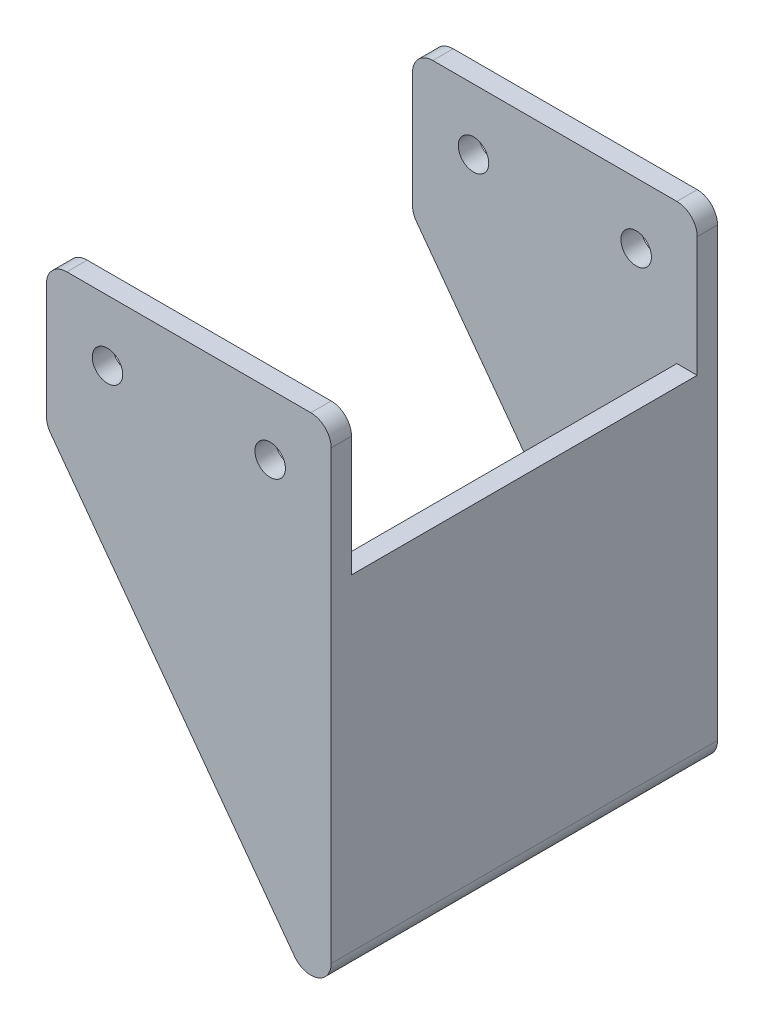
ISO-10303-21;
HEADER;
FILE_DESCRIPTION(('STEP AP214'),'2;1');
FILE_NAME('part.step','',(''),(''),'','','');
FILE_SCHEMA(('AUTOMOTIVE_DESIGN { 1 0 10303 214 1 1 1 1 }'));
ENDSEC;
DATA;
#1=APPLICATION_CONTEXT('core data for automotive mechanical design processes');
#2=APPLICATION_PROTOCOL_DEFINITION('international standard','automotive_design',2000,#1);
#3=PRODUCT_CONTEXT('',#1,'mechanical');
#4=PRODUCT('Part','Part','',(#3));
#5=PRODUCT_RELATED_PRODUCT_CATEGORY('part','',(#4));
#6=PRODUCT_DEFINITION_FORMATION('','',#4);
#7=PRODUCT_DEFINITION_CONTEXT('part definition',#1,'design');
#8=PRODUCT_DEFINITION('design','',#6,#7);
#9=PRODUCT_DEFINITION_SHAPE('','',#8);
#10=(LENGTH_UNIT() NAMED_UNIT(*) SI_UNIT(.MILLI.,.METRE.));
#11=(NAMED_UNIT(*) PLANE_ANGLE_UNIT() SI_UNIT($,.RADIAN.));
#12=(NAMED_UNIT(*) SI_UNIT($,.STERADIAN.) SOLID_ANGLE_UNIT());
#13=UNCERTAINTY_MEASURE_WITH_UNIT(LENGTH_MEASURE(1.E-05),#10,'distance_accuracy_value','');
#14=(GEOMETRIC_REPRESENTATION_CONTEXT(3) GLOBAL_UNCERTAINTY_ASSIGNED_CONTEXT((#13)) GLOBAL_UNIT_ASSIGNED_CONTEXT((#10,
#11,#12)) REPRESENTATION_CONTEXT('',''));
#15=CARTESIAN_POINT('',(0.,0.,0.));
#16=DIRECTION('',(0.,0.,1.));
#17=DIRECTION('',(1.,0.,0.));
#18=AXIS2_PLACEMENT_3D('',#15,#16,#17);
#19=CARTESIAN_POINT('',(-1.,-22.957082325542,9.5));
#20=DIRECTION('',(0.,0.,-1.));
#21=DIRECTION('',(-1.,0.,0.));
#22=AXIS2_PLACEMENT_3D('',#19,#20,#21);
#23=CYLINDRICAL_SURFACE('',#22,1.);
#24=CARTESIAN_POINT('',(-1.,-22.957082325542,-8.5));
#25=DIRECTION('',(0.,0.,1.));
#26=DIRECTION('',(1.,0.,0.));
#27=AXIS2_PLACEMENT_3D('',#24,#25,#26);
#28=CIRCLE('',#27,1.);
#29=CARTESIAN_POINT('',(-1.80505583735339,-23.5502813635918,-8.5));
#30=VERTEX_POINT('',#29);
#31=CARTESIAN_POINT('',(-1.,-23.957082325542,-8.5));
#32=VERTEX_POINT('',#31);
#33=EDGE_CURVE('E282',#30,#32,#28,.T.);
#34=ORIENTED_EDGE('',*,*,#33,.F.);
#35=DIRECTION('',(0.,0.,-1.));
#36=VECTOR('',#35,1.);
#37=CARTESIAN_POINT('',(-1.80505583735339,-23.5502813635918,9.5));
#38=LINE('',#37,#36);
#39=CARTESIAN_POINT('',(-1.80505583735339,-23.5502813635918,-9.5));
#40=VERTEX_POINT('',#39);
#41=EDGE_CURVE('E90',#30,#40,#38,.T.);
#42=ORIENTED_EDGE('',*,*,#41,.T.);
#43=CARTESIAN_POINT('',(-1.,-22.957082325542,-9.5));
#44=DIRECTION('',(0.,0.,1.));
#45=DIRECTION('',(-1.,0.,0.));
#46=AXIS2_PLACEMENT_3D('',#43,#44,#45);
#47=CIRCLE('',#46,1.);
#48=CARTESIAN_POINT('',(0.,-22.957082325542,-9.5));
#49=VERTEX_POINT('',#48);
#50=EDGE_CURVE('E146',#40,#49,#47,.T.);
#51=ORIENTED_EDGE('',*,*,#50,.T.);
#52=DIRECTION('',(0.,0.,-1.));
#53=VECTOR('',#52,1.);
#54=CARTESIAN_POINT('',(0.,-22.957082325542,9.5));
#55=LINE('',#54,#53);
#56=CARTESIAN_POINT('',(0.,-22.957082325542,9.5));
#57=VERTEX_POINT('',#56);
#58=EDGE_CURVE('E189',#57,#49,#55,.T.);
#59=ORIENTED_EDGE('',*,*,#58,.F.);
#60=CARTESIAN_POINT('',(-1.,-22.957082325542,9.5));
#61=DIRECTION('',(0.,0.,1.));
#62=DIRECTION('',(-1.,0.,0.));
#63=AXIS2_PLACEMENT_3D('',#60,#61,#62);
#64=CIRCLE('',#63,1.);
#65=CARTESIAN_POINT('',(-1.80505583735339,-23.5502813635918,9.5));
#66=VERTEX_POINT('',#65);
#67=EDGE_CURVE('E169',#66,#57,#64,.T.);
#68=ORIENTED_EDGE('',*,*,#67,.F.);
#69=CARTESIAN_POINT('',(-1.80505583735339,-23.5502813635918,8.5));
#70=VERTEX_POINT('',#69);
#71=EDGE_CURVE('E170',#66,#70,#38,.T.);
#72=ORIENTED_EDGE('',*,*,#71,.T.);
#73=CARTESIAN_POINT('',(-1.,-22.957082325542,8.5));
#74=DIRECTION('',(0.,0.,1.));
#75=DIRECTION('',(1.,0.,0.));
#76=AXIS2_PLACEMENT_3D('',#73,#74,#75);
#77=CIRCLE('',#76,1.);
#78=CARTESIAN_POINT('',(-1.,-23.957082325542,8.5));
#79=VERTEX_POINT('',#78);
#80=EDGE_CURVE('E47',#70,#79,#77,.T.);
#81=ORIENTED_EDGE('',*,*,#80,.T.);
#82=DIRECTION('',(0.,0.,-1.));
#83=VECTOR('',#82,1.);
#84=CARTESIAN_POINT('',(-1.,-23.957082325542,9.5));
#85=LINE('',#84,#83);
#86=EDGE_CURVE('E11',#79,#32,#85,.T.);
#87=ORIENTED_EDGE('',*,*,#86,.T.);
#88=EDGE_LOOP('',(#34,#42,#51,#59,#68,#72,#81,#87));
#89=FACE_BOUND('',#88,.T.);
#90=ADVANCED_FACE('F33',(#89),#23,.T.);
#91=CARTESIAN_POINT('',(0.,-1.00000000000001,9.5));
#92=DIRECTION('',(-1.,0.,0.));
#93=DIRECTION('',(0.,0.,1.));
#94=AXIS2_PLACEMENT_3D('',#91,#92,#93);
#95=PLANE('',#94);
#96=DIRECTION('',(0.,1.,0.));
#97=VECTOR('',#96,1.);
#98=CARTESIAN_POINT('',(0.,-1.00000000000001,-8.5));
#99=LINE('',#98,#97);
#100=CARTESIAN_POINT('',(0.,-6.90709701946873,-8.5));
#101=VERTEX_POINT('',#100);
#102=CARTESIAN_POINT('',(0.,-1.,-8.5));
#103=VERTEX_POINT('',#102);
#104=EDGE_CURVE('E211',#101,#103,#99,.T.);
#105=ORIENTED_EDGE('',*,*,#104,.F.);
#106=DIRECTION('',(0.,0.,1.));
#107=VECTOR('',#106,1.);
#108=CARTESIAN_POINT('',(0.,-6.90709701946873,9.5));
#109=LINE('',#108,#107);
#110=CARTESIAN_POINT('',(0.,-6.90709701946873,8.5));
#111=VERTEX_POINT('',#110);
#112=EDGE_CURVE('E40',#101,#111,#109,.T.);
#113=ORIENTED_EDGE('',*,*,#112,.T.);
#114=DIRECTION('',(0.,1.,0.));
#115=VECTOR('',#114,1.);
#116=CARTESIAN_POINT('',(0.,-1.00000000000001,8.5));
#117=LINE('',#116,#115);
#118=CARTESIAN_POINT('',(0.,-1.,8.5));
#119=VERTEX_POINT('',#118);
#120=EDGE_CURVE('E207',#111,#119,#117,.T.);
#121=ORIENTED_EDGE('',*,*,#120,.T.);
#122=DIRECTION('',(0.,0.,-1.));
#123=VECTOR('',#122,1.);
#124=CARTESIAN_POINT('',(0.,-1.00000000000001,9.5));
#125=LINE('',#124,#123);
#126=CARTESIAN_POINT('',(0.,-1.00000000000001,9.5));
#127=VERTEX_POINT('',#126);
#128=EDGE_CURVE('E186',#127,#119,#125,.T.);
#129=ORIENTED_EDGE('',*,*,#128,.F.);
#130=DIRECTION('',(0.,1.,0.));
#131=VECTOR('',#130,1.);
#132=CARTESIAN_POINT('',(0.,-1.00000000000001,9.5));
#133=LINE('',#132,#131);
#134=EDGE_CURVE('E99',#57,#127,#133,.T.);
#135=ORIENTED_EDGE('',*,*,#134,.F.);
#136=ORIENTED_EDGE('',*,*,#58,.T.);
#137=DIRECTION('',(0.,1.,0.));
#138=VECTOR('',#137,1.);
#139=CARTESIAN_POINT('',(0.,-1.00000000000001,-9.5));
#140=LINE('',#139,#138);
#141=CARTESIAN_POINT('',(0.,-1.00000000000001,-9.5));
#142=VERTEX_POINT('',#141);
#143=EDGE_CURVE('E148',#49,#142,#140,.T.);
#144=ORIENTED_EDGE('',*,*,#143,.T.);
#145=EDGE_CURVE('E185',#103,#142,#125,.T.);
#146=ORIENTED_EDGE('',*,*,#145,.F.);
#147=EDGE_LOOP('',(#105,#113,#121,#129,#135,#136,#144,#146));
#148=FACE_BOUND('',#147,.T.);
#149=ADVANCED_FACE('F204',(#148),#95,.F.);
#150=CARTESIAN_POINT('',(-1.,-1.,9.5));
#151=DIRECTION('',(0.,0.,-1.));
#152=DIRECTION('',(-1.,0.,0.));
#153=AXIS2_PLACEMENT_3D('',#150,#151,#152);
#154=CYLINDRICAL_SURFACE('',#153,1.);
#155=CARTESIAN_POINT('',(-1.,-1.,-8.5));
#156=DIRECTION('',(0.,0.,1.));
#157=DIRECTION('',(1.,0.,0.));
#158=AXIS2_PLACEMENT_3D('',#155,#156,#157);
#159=CIRCLE('',#158,1.);
#160=CARTESIAN_POINT('',(-1.00000000000001,0.,-8.5));
#161=VERTEX_POINT('',#160);
#162=EDGE_CURVE('E279',#103,#161,#159,.T.);
#163=ORIENTED_EDGE('',*,*,#162,.F.);
#164=ORIENTED_EDGE('',*,*,#145,.T.);
#165=CARTESIAN_POINT('',(-1.,-1.,-9.5));
#166=DIRECTION('',(0.,0.,1.));
#167=DIRECTION('',(1.,0.,0.));
#168=AXIS2_PLACEMENT_3D('',#165,#166,#167);
#169=CIRCLE('',#168,1.);
#170=CARTESIAN_POINT('',(-1.00000000000001,0.,-9.5));
#171=VERTEX_POINT('',#170);
#172=EDGE_CURVE('E152',#142,#171,#169,.T.);
#173=ORIENTED_EDGE('',*,*,#172,.T.);
#174=DIRECTION('',(0.,0.,-1.));
#175=VECTOR('',#174,1.);
#176=CARTESIAN_POINT('',(-1.00000000000001,0.,9.5));
#177=LINE('',#176,#175);
#178=EDGE_CURVE('E181',#161,#171,#177,.T.);
#179=ORIENTED_EDGE('',*,*,#178,.F.);
#180=EDGE_LOOP('',(#163,#164,#173,#179));
#181=FACE_BOUND('',#180,.T.);
#182=ADVANCED_FACE('F340',(#181),#154,.T.);
#183=CARTESIAN_POINT('',(-13.,0.,9.5));
#184=DIRECTION('',(0.,-1.,0.));
#185=DIRECTION('',(0.,0.,-1.));
#186=AXIS2_PLACEMENT_3D('',#183,#184,#185);
#187=PLANE('',#186);
#188=DIRECTION('',(-1.,0.,0.));
#189=VECTOR('',#188,1.);
#190=CARTESIAN_POINT('',(-13.,0.,-8.5));
#191=LINE('',#190,#189);
#192=CARTESIAN_POINT('',(-13.,0.,-8.5));
#193=VERTEX_POINT('',#192);
#194=EDGE_CURVE('E276',#161,#193,#191,.T.);
#195=ORIENTED_EDGE('',*,*,#194,.F.);
#196=ORIENTED_EDGE('',*,*,#178,.T.);
#197=DIRECTION('',(-1.,0.,0.));
#198=VECTOR('',#197,1.);
#199=CARTESIAN_POINT('',(-13.,0.,-9.5));
#200=LINE('',#199,#198);
#201=CARTESIAN_POINT('',(-13.,0.,-9.5));
#202=VERTEX_POINT('',#201);
#203=EDGE_CURVE('E155',#171,#202,#200,.T.);
#204=ORIENTED_EDGE('',*,*,#203,.T.);
#205=DIRECTION('',(0.,0.,-1.));
#206=VECTOR('',#205,1.);
#207=CARTESIAN_POINT('',(-13.,0.,9.5));
#208=LINE('',#207,#206);
#209=EDGE_CURVE('E177',#193,#202,#208,.T.);
#210=ORIENTED_EDGE('',*,*,#209,.F.);
#211=EDGE_LOOP('',(#195,#196,#204,#210));
#212=FACE_BOUND('',#211,.T.);
#213=ADVANCED_FACE('F339',(#212),#187,.F.);
#214=CARTESIAN_POINT('',(-13.,-1.,9.5));
#215=DIRECTION('',(0.,0.,-1.));
#216=DIRECTION('',(-1.,0.,0.));
#217=AXIS2_PLACEMENT_3D('',#214,#215,#216);
#218=CYLINDRICAL_SURFACE('',#217,1.);
#219=CARTESIAN_POINT('',(-13.,-1.,-8.5));
#220=DIRECTION('',(0.,0.,1.));
#221=DIRECTION('',(1.,0.,0.));
#222=AXIS2_PLACEMENT_3D('',#219,#220,#221);
#223=CIRCLE('',#222,1.);
#224=CARTESIAN_POINT('',(-14.,-1.00000000000001,-8.5));
#225=VERTEX_POINT('',#224);
#226=EDGE_CURVE('E273',#193,#225,#223,.T.);
#227=ORIENTED_EDGE('',*,*,#226,.F.);
#228=ORIENTED_EDGE('',*,*,#209,.T.);
#229=CARTESIAN_POINT('',(-13.,-1.,-9.5));
#230=DIRECTION('',(0.,0.,1.));
#231=DIRECTION('',(-1.,0.,0.));
#232=AXIS2_PLACEMENT_3D('',#229,#230,#231);
#233=CIRCLE('',#232,1.);
#234=CARTESIAN_POINT('',(-14.,-1.00000000000001,-9.5));
#235=VERTEX_POINT('',#234);
#236=EDGE_CURVE('E158',#202,#235,#233,.T.);
#237=ORIENTED_EDGE('',*,*,#236,.T.);
#238=DIRECTION('',(0.,0.,-1.));
#239=VECTOR('',#238,1.);
#240=CARTESIAN_POINT('',(-14.,-1.00000000000001,9.5));
#241=LINE('',#240,#239);
#242=EDGE_CURVE('E136',#225,#235,#241,.T.);
#243=ORIENTED_EDGE('',*,*,#242,.F.);
#244=EDGE_LOOP('',(#227,#228,#237,#243));
#245=FACE_BOUND('',#244,.T.);
#246=ADVANCED_FACE('F352',(#245),#218,.T.);
#247=CARTESIAN_POINT('',(-14.,-6.67136803982772,9.5));
#248=DIRECTION('',(1.,0.,0.));
#249=DIRECTION('',(0.,0.,-1.));
#250=AXIS2_PLACEMENT_3D('',#247,#248,#249);
#251=PLANE('',#250);
#252=DIRECTION('',(0.,-1.,0.));
#253=VECTOR('',#252,1.);
#254=CARTESIAN_POINT('',(-14.,-6.67136803982772,-8.5));
#255=LINE('',#254,#253);
#256=CARTESIAN_POINT('',(-14.,-6.67136803982772,-8.5));
#257=VERTEX_POINT('',#256);
#258=EDGE_CURVE('E270',#225,#257,#255,.T.);
#259=ORIENTED_EDGE('',*,*,#258,.F.);
#260=ORIENTED_EDGE('',*,*,#242,.T.);
#261=DIRECTION('',(0.,-1.,0.));
#262=VECTOR('',#261,1.);
#263=CARTESIAN_POINT('',(-14.,-6.67136803982772,-9.5));
#264=LINE('',#263,#262);
#265=CARTESIAN_POINT('',(-14.,-6.67136803982772,-9.5));
#266=VERTEX_POINT('',#265);
#267=EDGE_CURVE('E161',#235,#266,#264,.T.);
#268=ORIENTED_EDGE('',*,*,#267,.T.);
#269=DIRECTION('',(0.,0.,-1.));
#270=VECTOR('',#269,1.);
#271=CARTESIAN_POINT('',(-14.,-6.67136803982772,9.5));
#272=LINE('',#271,#270);
#273=EDGE_CURVE('E137',#257,#266,#272,.T.);
#274=ORIENTED_EDGE('',*,*,#273,.F.);
#275=EDGE_LOOP('',(#259,#260,#268,#274));
#276=FACE_BOUND('',#275,.T.);
#277=ADVANCED_FACE('F357',(#276),#251,.F.);
#278=CARTESIAN_POINT('',(-13.,-6.67136803982772,9.5));
#279=DIRECTION('',(0.,0.,-1.));
#280=DIRECTION('',(-1.,0.,0.));
#281=AXIS2_PLACEMENT_3D('',#278,#279,#280);
#282=CYLINDRICAL_SURFACE('',#281,0.999999999999999);
#283=CARTESIAN_POINT('',(-13.,-6.67136803982772,-8.5));
#284=DIRECTION('',(0.,0.,1.));
#285=DIRECTION('',(1.,0.,0.));
#286=AXIS2_PLACEMENT_3D('',#283,#284,#285);
#287=CIRCLE('',#286,0.999999999999999);
#288=CARTESIAN_POINT('',(-13.8050558373534,-7.26456707787758,-8.5));
#289=VERTEX_POINT('',#288);
#290=EDGE_CURVE('E267',#257,#289,#287,.T.);
#291=ORIENTED_EDGE('',*,*,#290,.F.);
#292=ORIENTED_EDGE('',*,*,#273,.T.);
#293=CARTESIAN_POINT('',(-13.,-6.67136803982772,-9.5));
#294=DIRECTION('',(0.,0.,1.));
#295=DIRECTION('',(-1.,0.,0.));
#296=AXIS2_PLACEMENT_3D('',#293,#294,#295);
#297=CIRCLE('',#296,0.999999999999999);
#298=CARTESIAN_POINT('',(-13.8050558373534,-7.26456707787758,-9.5));
#299=VERTEX_POINT('',#298);
#300=EDGE_CURVE('E164',#266,#299,#297,.T.);
#301=ORIENTED_EDGE('',*,*,#300,.T.);
#302=DIRECTION('',(0.,0.,-1.));
#303=VECTOR('',#302,1.);
#304=CARTESIAN_POINT('',(-13.8050558373534,-7.26456707787758,9.5));
#305=LINE('',#304,#303);
#306=EDGE_CURVE('E173',#289,#299,#305,.T.);
#307=ORIENTED_EDGE('',*,*,#306,.F.);
#308=EDGE_LOOP('',(#291,#292,#301,#307));
#309=FACE_BOUND('',#308,.T.);
#310=ADVANCED_FACE('F359',(#309),#282,.T.);
#311=CARTESIAN_POINT('',(-1.80505583735339,-23.5502813635918,9.5));
#312=DIRECTION('',(0.805055837353368,0.59319903804985,0.));
#313=DIRECTION('',(-0.59319903804985,0.805055837353368,0.));
#314=AXIS2_PLACEMENT_3D('',#311,#312,#313);
#315=PLANE('',#314);
#316=DIRECTION('',(0.59319903804985,-0.805055837353368,0.));
#317=VECTOR('',#316,1.);
#318=CARTESIAN_POINT('',(-1.80505583735339,-23.5502813635918,-8.5));
#319=LINE('',#318,#317);
#320=EDGE_CURVE('E264',#289,#30,#319,.T.);
#321=ORIENTED_EDGE('',*,*,#320,.F.);
#322=ORIENTED_EDGE('',*,*,#306,.T.);
#323=DIRECTION('',(0.59319903804985,-0.805055837353368,0.));
#324=VECTOR('',#323,1.);
#325=CARTESIAN_POINT('',(-1.80505583735339,-23.5502813635918,-9.5));
#326=LINE('',#325,#324);
#327=EDGE_CURVE('E167',#299,#40,#326,.T.);
#328=ORIENTED_EDGE('',*,*,#327,.T.);
#329=ORIENTED_EDGE('',*,*,#41,.F.);
#330=EDGE_LOOP('',(#321,#322,#328,#329));
#331=FACE_BOUND('',#330,.T.);
#332=ADVANCED_FACE('F364',(#331),#315,.F.);
#333=CARTESIAN_POINT('',(-11.,-3.,9.5));
#334=DIRECTION('',(0.,0.,-1.));
#335=DIRECTION('',(-1.,0.,0.));
#336=AXIS2_PLACEMENT_3D('',#333,#334,#335);
#337=CYLINDRICAL_SURFACE('',#336,0.75);
#338=CARTESIAN_POINT('',(-11.,-3.,-9.5));
#339=DIRECTION('',(0.,0.,1.));
#340=DIRECTION('',(1.,0.,0.));
#341=AXIS2_PLACEMENT_3D('',#338,#339,#340);
#342=CIRCLE('',#341,0.75);
#343=CARTESIAN_POINT('',(-10.25,-3.,-9.5));
#344=VERTEX_POINT('',#343);
#345=EDGE_CURVE('E288',#344,#344,#342,.T.);
#346=ORIENTED_EDGE('',*,*,#345,.F.);
#347=EDGE_LOOP('',(#346));
#348=FACE_BOUND('',#347,.T.);
#349=CARTESIAN_POINT('',(-11.,-3.,-8.5));
#350=DIRECTION('',(0.,0.,1.));
#351=DIRECTION('',(1.,0.,0.));
#352=AXIS2_PLACEMENT_3D('',#349,#350,#351);
#353=CIRCLE('',#352,0.75);
#354=CARTESIAN_POINT('',(-10.25,-3.,-8.5));
#355=VERTEX_POINT('',#354);
#356=EDGE_CURVE('E198',#355,#355,#353,.T.);
#357=ORIENTED_EDGE('',*,*,#356,.T.);
#358=EDGE_LOOP('',(#357));
#359=FACE_BOUND('',#358,.T.);
#360=ADVANCED_FACE('F388',(#348,#359),#337,.F.);
#361=CARTESIAN_POINT('',(-3.,-3.,9.5));
#362=DIRECTION('',(0.,0.,-1.));
#363=DIRECTION('',(-1.,0.,0.));
#364=AXIS2_PLACEMENT_3D('',#361,#362,#363);
#365=CYLINDRICAL_SURFACE('',#364,0.75);
#366=CARTESIAN_POINT('',(-3.,-3.,-9.5));
#367=DIRECTION('',(0.,0.,1.));
#368=DIRECTION('',(1.,0.,0.));
#369=AXIS2_PLACEMENT_3D('',#366,#367,#368);
#370=CIRCLE('',#369,0.75);
#371=CARTESIAN_POINT('',(-2.25,-3.,-9.5));
#372=VERTEX_POINT('',#371);
#373=EDGE_CURVE('E284',#372,#372,#370,.T.);
#374=ORIENTED_EDGE('',*,*,#373,.F.);
#375=EDGE_LOOP('',(#374));
#376=FACE_BOUND('',#375,.T.);
#377=CARTESIAN_POINT('',(-3.,-3.,-8.5));
#378=DIRECTION('',(0.,0.,1.));
#379=DIRECTION('',(1.,0.,0.));
#380=AXIS2_PLACEMENT_3D('',#377,#378,#379);
#381=CIRCLE('',#380,0.75);
#382=CARTESIAN_POINT('',(-2.25,-3.,-8.5));
#383=VERTEX_POINT('',#382);
#384=EDGE_CURVE('E196',#383,#383,#381,.T.);
#385=ORIENTED_EDGE('',*,*,#384,.T.);
#386=EDGE_LOOP('',(#385));
#387=FACE_BOUND('',#386,.T.);
#388=ADVANCED_FACE('F449',(#376,#387),#365,.F.);
#389=CARTESIAN_POINT('',(-1.,-22.957082325542,9.5));
#390=DIRECTION('',(0.,0.,-1.));
#391=DIRECTION('',(-1.,0.,0.));
#392=AXIS2_PLACEMENT_3D('',#389,#390,#391);
#393=PLANE('',#392);
#394=ORIENTED_EDGE('',*,*,#67,.T.);
#395=ORIENTED_EDGE('',*,*,#134,.T.);
#396=CARTESIAN_POINT('',(-1.,-1.,9.5));
#397=DIRECTION('',(0.,0.,1.));
#398=DIRECTION('',(1.,0.,0.));
#399=AXIS2_PLACEMENT_3D('',#396,#397,#398);
#400=CIRCLE('',#399,1.);
#401=CARTESIAN_POINT('',(-1.00000000000001,0.,9.5));
#402=VERTEX_POINT('',#401);
#403=EDGE_CURVE('E297',#127,#402,#400,.T.);
#404=ORIENTED_EDGE('',*,*,#403,.T.);
#405=DIRECTION('',(-1.,0.,0.));
#406=VECTOR('',#405,1.);
#407=CARTESIAN_POINT('',(-13.,0.,9.5));
#408=LINE('',#407,#406);
#409=CARTESIAN_POINT('',(-13.,0.,9.5));
#410=VERTEX_POINT('',#409);
#411=EDGE_CURVE('E299',#402,#410,#408,.T.);
#412=ORIENTED_EDGE('',*,*,#411,.T.);
#413=CARTESIAN_POINT('',(-13.,-1.,9.5));
#414=DIRECTION('',(0.,0.,1.));
#415=DIRECTION('',(-1.,0.,0.));
#416=AXIS2_PLACEMENT_3D('',#413,#414,#415);
#417=CIRCLE('',#416,1.);
#418=CARTESIAN_POINT('',(-14.,-1.00000000000001,9.5));
#419=VERTEX_POINT('',#418);
#420=EDGE_CURVE('E122',#410,#419,#417,.T.);
#421=ORIENTED_EDGE('',*,*,#420,.T.);
#422=DIRECTION('',(0.,-1.,0.));
#423=VECTOR('',#422,1.);
#424=CARTESIAN_POINT('',(-14.,-6.67136803982772,9.5));
#425=LINE('',#424,#423);
#426=CARTESIAN_POINT('',(-14.,-6.67136803982772,9.5));
#427=VERTEX_POINT('',#426);
#428=EDGE_CURVE('E114',#419,#427,#425,.T.);
#429=ORIENTED_EDGE('',*,*,#428,.T.);
#430=CARTESIAN_POINT('',(-13.,-6.67136803982772,9.5));
#431=DIRECTION('',(0.,0.,1.));
#432=DIRECTION('',(-1.,0.,0.));
#433=AXIS2_PLACEMENT_3D('',#430,#431,#432);
#434=CIRCLE('',#433,0.999999999999999);
#435=CARTESIAN_POINT('',(-13.8050558373534,-7.26456707787758,9.5));
#436=VERTEX_POINT('',#435);
#437=EDGE_CURVE('E119',#427,#436,#434,.T.);
#438=ORIENTED_EDGE('',*,*,#437,.T.);
#439=DIRECTION('',(0.59319903804985,-0.805055837353368,0.));
#440=VECTOR('',#439,1.);
#441=CARTESIAN_POINT('',(-1.80505583735339,-23.5502813635918,9.5));
#442=LINE('',#441,#440);
#443=EDGE_CURVE('E56',#436,#66,#442,.T.);
#444=ORIENTED_EDGE('',*,*,#443,.T.);
#445=EDGE_LOOP('',(#394,#395,#404,#412,#421,#429,#438,#444));
#446=FACE_BOUND('',#445,.T.);
#447=CARTESIAN_POINT('',(-11.,-3.,9.5));
#448=DIRECTION('',(0.,0.,1.));
#449=DIRECTION('',(1.,0.,0.));
#450=AXIS2_PLACEMENT_3D('',#447,#448,#449);
#451=CIRCLE('',#450,0.75);
#452=CARTESIAN_POINT('',(-10.25,-3.,9.5));
#453=VERTEX_POINT('',#452);
#454=EDGE_CURVE('E149',#453,#453,#451,.T.);
#455=ORIENTED_EDGE('',*,*,#454,.F.);
#456=EDGE_LOOP('',(#455));
#457=FACE_BOUND('',#456,.T.);
#458=CARTESIAN_POINT('',(-3.,-3.,9.5));
#459=DIRECTION('',(0.,0.,1.));
#460=DIRECTION('',(1.,0.,0.));
#461=AXIS2_PLACEMENT_3D('',#458,#459,#460);
#462=CIRCLE('',#461,0.75);
#463=CARTESIAN_POINT('',(-2.25,-3.,9.5));
#464=VERTEX_POINT('',#463);
#465=EDGE_CURVE('E285',#464,#464,#462,.T.);
#466=ORIENTED_EDGE('',*,*,#465,.F.);
#467=EDGE_LOOP('',(#466));
#468=FACE_BOUND('',#467,.T.);
#469=ADVANCED_FACE('F116',(#446,#457,#468),#393,.F.);
#470=CARTESIAN_POINT('',(-1.,-22.957082325542,-9.5));
#471=DIRECTION('',(0.,0.,-1.));
#472=DIRECTION('',(-1.,0.,0.));
#473=AXIS2_PLACEMENT_3D('',#470,#471,#472);
#474=PLANE('',#473);
#475=ORIENTED_EDGE('',*,*,#345,.T.);
#476=EDGE_LOOP('',(#475));
#477=FACE_BOUND('',#476,.T.);
#478=ORIENTED_EDGE('',*,*,#50,.F.);
#479=ORIENTED_EDGE('',*,*,#327,.F.);
#480=ORIENTED_EDGE('',*,*,#300,.F.);
#481=ORIENTED_EDGE('',*,*,#267,.F.);
#482=ORIENTED_EDGE('',*,*,#236,.F.);
#483=ORIENTED_EDGE('',*,*,#203,.F.);
#484=ORIENTED_EDGE('',*,*,#172,.F.);
#485=ORIENTED_EDGE('',*,*,#143,.F.);
#486=EDGE_LOOP('',(#478,#479,#480,#481,#482,#483,#484,#485));
#487=FACE_BOUND('',#486,.T.);
#488=ORIENTED_EDGE('',*,*,#373,.T.);
#489=EDGE_LOOP('',(#488));
#490=FACE_BOUND('',#489,.T.);
#491=ADVANCED_FACE('F346',(#477,#487,#490),#474,.T.);
#492=ORIENTED_EDGE('',*,*,#128,.T.);
#493=CARTESIAN_POINT('',(-1.,-1.,8.5));
#494=DIRECTION('',(0.,0.,1.));
#495=DIRECTION('',(1.,0.,0.));
#496=AXIS2_PLACEMENT_3D('',#493,#494,#495);
#497=CIRCLE('',#496,1.);
#498=CARTESIAN_POINT('',(-1.00000000000001,0.,8.5));
#499=VERTEX_POINT('',#498);
#500=EDGE_CURVE('E257',#119,#499,#497,.T.);
#501=ORIENTED_EDGE('',*,*,#500,.T.);
#502=EDGE_CURVE('E182',#402,#499,#177,.T.);
#503=ORIENTED_EDGE('',*,*,#502,.F.);
#504=ORIENTED_EDGE('',*,*,#403,.F.);
#505=EDGE_LOOP('',(#492,#501,#503,#504));
#506=FACE_BOUND('',#505,.T.);
#507=ADVANCED_FACE('F368',(#506),#154,.T.);
#508=ORIENTED_EDGE('',*,*,#502,.T.);
#509=DIRECTION('',(-1.,0.,0.));
#510=VECTOR('',#509,1.);
#511=CARTESIAN_POINT('',(-13.,0.,8.5));
#512=LINE('',#511,#510);
#513=CARTESIAN_POINT('',(-13.,0.,8.5));
#514=VERTEX_POINT('',#513);
#515=EDGE_CURVE('E254',#499,#514,#512,.T.);
#516=ORIENTED_EDGE('',*,*,#515,.T.);
#517=EDGE_CURVE('E178',#410,#514,#208,.T.);
#518=ORIENTED_EDGE('',*,*,#517,.F.);
#519=ORIENTED_EDGE('',*,*,#411,.F.);
#520=EDGE_LOOP('',(#508,#516,#518,#519));
#521=FACE_BOUND('',#520,.T.);
#522=ADVANCED_FACE('F305',(#521),#187,.F.);
#523=ORIENTED_EDGE('',*,*,#517,.T.);
#524=CARTESIAN_POINT('',(-13.,-1.,8.5));
#525=DIRECTION('',(0.,0.,1.));
#526=DIRECTION('',(1.,0.,0.));
#527=AXIS2_PLACEMENT_3D('',#524,#525,#526);
#528=CIRCLE('',#527,1.);
#529=CARTESIAN_POINT('',(-14.,-1.00000000000001,8.5));
#530=VERTEX_POINT('',#529);
#531=EDGE_CURVE('E251',#514,#530,#528,.T.);
#532=ORIENTED_EDGE('',*,*,#531,.T.);
#533=EDGE_CURVE('E175',#419,#530,#241,.T.);
#534=ORIENTED_EDGE('',*,*,#533,.F.);
#535=ORIENTED_EDGE('',*,*,#420,.F.);
#536=EDGE_LOOP('',(#523,#532,#534,#535));
#537=FACE_BOUND('',#536,.T.);
#538=ADVANCED_FACE('F309',(#537),#218,.T.);
#539=ORIENTED_EDGE('',*,*,#533,.T.);
#540=DIRECTION('',(0.,-1.,0.));
#541=VECTOR('',#540,1.);
#542=CARTESIAN_POINT('',(-14.,-6.67136803982772,8.5));
#543=LINE('',#542,#541);
#544=CARTESIAN_POINT('',(-14.,-6.67136803982772,8.5));
#545=VERTEX_POINT('',#544);
#546=EDGE_CURVE('E133',#530,#545,#543,.T.);
#547=ORIENTED_EDGE('',*,*,#546,.T.);
#548=EDGE_CURVE('E129',#427,#545,#272,.T.);
#549=ORIENTED_EDGE('',*,*,#548,.F.);
#550=ORIENTED_EDGE('',*,*,#428,.F.);
#551=EDGE_LOOP('',(#539,#547,#549,#550));
#552=FACE_BOUND('',#551,.T.);
#553=ADVANCED_FACE('F130',(#552),#251,.F.);
#554=ORIENTED_EDGE('',*,*,#548,.T.);
#555=CARTESIAN_POINT('',(-13.,-6.67136803982772,8.5));
#556=DIRECTION('',(0.,0.,1.));
#557=DIRECTION('',(1.,0.,0.));
#558=AXIS2_PLACEMENT_3D('',#555,#556,#557);
#559=CIRCLE('',#558,0.999999999999999);
#560=CARTESIAN_POINT('',(-13.8050558373534,-7.26456707787758,8.5));
#561=VERTEX_POINT('',#560);
#562=EDGE_CURVE('E248',#545,#561,#559,.T.);
#563=ORIENTED_EDGE('',*,*,#562,.T.);
#564=EDGE_CURVE('E141',#436,#561,#305,.T.);
#565=ORIENTED_EDGE('',*,*,#564,.F.);
#566=ORIENTED_EDGE('',*,*,#437,.F.);
#567=EDGE_LOOP('',(#554,#563,#565,#566));
#568=FACE_BOUND('',#567,.T.);
#569=ADVANCED_FACE('F139',(#568),#282,.T.);
#570=ORIENTED_EDGE('',*,*,#564,.T.);
#571=DIRECTION('',(0.59319903804985,-0.805055837353368,0.));
#572=VECTOR('',#571,1.);
#573=CARTESIAN_POINT('',(-1.80505583735339,-23.5502813635918,8.5));
#574=LINE('',#573,#572);
#575=EDGE_CURVE('E246',#561,#70,#574,.T.);
#576=ORIENTED_EDGE('',*,*,#575,.T.);
#577=ORIENTED_EDGE('',*,*,#71,.F.);
#578=ORIENTED_EDGE('',*,*,#443,.F.);
#579=EDGE_LOOP('',(#570,#576,#577,#578));
#580=FACE_BOUND('',#579,.T.);
#581=ADVANCED_FACE('F377',(#580),#315,.F.);
#582=CARTESIAN_POINT('',(-11.,-3.,8.5));
#583=DIRECTION('',(0.,0.,1.));
#584=DIRECTION('',(1.,0.,0.));
#585=AXIS2_PLACEMENT_3D('',#582,#583,#584);
#586=CIRCLE('',#585,0.75);
#587=CARTESIAN_POINT('',(-10.25,-3.,8.5));
#588=VERTEX_POINT('',#587);
#589=EDGE_CURVE('E194',#588,#588,#586,.T.);
#590=ORIENTED_EDGE('',*,*,#589,.F.);
#591=EDGE_LOOP('',(#590));
#592=FACE_BOUND('',#591,.T.);
#593=ORIENTED_EDGE('',*,*,#454,.T.);
#594=EDGE_LOOP('',(#593));
#595=FACE_BOUND('',#594,.T.);
#596=ADVANCED_FACE('F379',(#592,#595),#337,.F.);
#597=CARTESIAN_POINT('',(-3.,-3.,8.5));
#598=DIRECTION('',(0.,0.,1.));
#599=DIRECTION('',(1.,0.,0.));
#600=AXIS2_PLACEMENT_3D('',#597,#598,#599);
#601=CIRCLE('',#600,0.75);
#602=CARTESIAN_POINT('',(-2.25,-3.,8.5));
#603=VERTEX_POINT('',#602);
#604=EDGE_CURVE('E191',#603,#603,#601,.T.);
#605=ORIENTED_EDGE('',*,*,#604,.F.);
#606=EDGE_LOOP('',(#605));
#607=FACE_BOUND('',#606,.T.);
#608=ORIENTED_EDGE('',*,*,#465,.T.);
#609=EDGE_LOOP('',(#608));
#610=FACE_BOUND('',#609,.T.);
#611=ADVANCED_FACE('F385',(#607,#610),#365,.F.);
#612=CARTESIAN_POINT('',(-1.,-28.3485790476334,-8.5));
#613=DIRECTION('',(1.,0.,0.));
#614=DIRECTION('',(0.,1.,0.));
#615=AXIS2_PLACEMENT_3D('',#612,#613,#614);
#616=PLANE('',#615);
#617=DIRECTION('',(0.,1.,0.));
#618=VECTOR('',#617,1.);
#619=CARTESIAN_POINT('',(-1.,-28.3485790476334,8.5));
#620=LINE('',#619,#618);
#621=CARTESIAN_POINT('',(-1.,-6.90709701946873,8.5));
#622=VERTEX_POINT('',#621);
#623=EDGE_CURVE('E240',#79,#622,#620,.T.);
#624=ORIENTED_EDGE('',*,*,#623,.T.);
#625=DIRECTION('',(0.,0.,1.));
#626=VECTOR('',#625,1.);
#627=CARTESIAN_POINT('',(-1.,-6.90709701946873,-8.5));
#628=LINE('',#627,#626);
#629=CARTESIAN_POINT('',(-1.,-6.90709701946873,-8.5));
#630=VERTEX_POINT('',#629);
#631=EDGE_CURVE('E195',#630,#622,#628,.T.);
#632=ORIENTED_EDGE('',*,*,#631,.F.);
#633=DIRECTION('',(0.,1.,0.));
#634=VECTOR('',#633,1.);
#635=CARTESIAN_POINT('',(-1.,-28.3485790476334,-8.5));
#636=LINE('',#635,#634);
#637=EDGE_CURVE('E234',#32,#630,#636,.T.);
#638=ORIENTED_EDGE('',*,*,#637,.F.);
#639=ORIENTED_EDGE('',*,*,#86,.F.);
#640=EDGE_LOOP('',(#624,#632,#638,#639));
#641=FACE_BOUND('',#640,.T.);
#642=ADVANCED_FACE('F500',(#641),#616,.F.);
#643=CARTESIAN_POINT('',(-1.,-6.90709701946873,-8.5));
#644=DIRECTION('',(0.,-1.,0.));
#645=DIRECTION('',(0.,0.,-1.));
#646=AXIS2_PLACEMENT_3D('',#643,#644,#645);
#647=PLANE('',#646);
#648=DIRECTION('',(1.,0.,0.));
#649=VECTOR('',#648,1.);
#650=CARTESIAN_POINT('',(-1.,-6.90709701946873,-8.5));
#651=LINE('',#650,#649);
#652=EDGE_CURVE('E222',#630,#101,#651,.T.);
#653=ORIENTED_EDGE('',*,*,#652,.F.);
#654=ORIENTED_EDGE('',*,*,#631,.T.);
#655=DIRECTION('',(1.,0.,0.));
#656=VECTOR('',#655,1.);
#657=CARTESIAN_POINT('',(-1.,-6.90709701946873,8.5));
#658=LINE('',#657,#656);
#659=EDGE_CURVE('E224',#622,#111,#658,.T.);
#660=ORIENTED_EDGE('',*,*,#659,.T.);
#661=ORIENTED_EDGE('',*,*,#112,.F.);
#662=EDGE_LOOP('',(#653,#654,#660,#661));
#663=FACE_BOUND('',#662,.T.);
#664=ADVANCED_FACE('F219',(#663),#647,.F.);
#665=CARTESIAN_POINT('',(0.,0.,-8.5));
#666=DIRECTION('',(0.,0.,1.));
#667=DIRECTION('',(1.,0.,0.));
#668=AXIS2_PLACEMENT_3D('',#665,#666,#667);
#669=PLANE('',#668);
#670=ORIENTED_EDGE('',*,*,#384,.F.);
#671=EDGE_LOOP('',(#670));
#672=FACE_BOUND('',#671,.T.);
#673=ORIENTED_EDGE('',*,*,#356,.F.);
#674=EDGE_LOOP('',(#673));
#675=FACE_BOUND('',#674,.T.);
#676=ORIENTED_EDGE('',*,*,#33,.T.);
#677=ORIENTED_EDGE('',*,*,#637,.T.);
#678=ORIENTED_EDGE('',*,*,#652,.T.);
#679=ORIENTED_EDGE('',*,*,#104,.T.);
#680=ORIENTED_EDGE('',*,*,#162,.T.);
#681=ORIENTED_EDGE('',*,*,#194,.T.);
#682=ORIENTED_EDGE('',*,*,#226,.T.);
#683=ORIENTED_EDGE('',*,*,#258,.T.);
#684=ORIENTED_EDGE('',*,*,#290,.T.);
#685=ORIENTED_EDGE('',*,*,#320,.T.);
#686=EDGE_LOOP('',(#676,#677,#678,#679,#680,#681,#682,#683,#684,#685));
#687=FACE_BOUND('',#686,.T.);
#688=ADVANCED_FACE('F230',(#672,#675,#687),#669,.T.);
#689=CARTESIAN_POINT('',(0.,0.,8.5));
#690=DIRECTION('',(0.,0.,1.));
#691=DIRECTION('',(1.,0.,0.));
#692=AXIS2_PLACEMENT_3D('',#689,#690,#691);
#693=PLANE('',#692);
#694=ORIENTED_EDGE('',*,*,#589,.T.);
#695=EDGE_LOOP('',(#694));
#696=FACE_BOUND('',#695,.T.);
#697=ORIENTED_EDGE('',*,*,#604,.T.);
#698=EDGE_LOOP('',(#697));
#699=FACE_BOUND('',#698,.T.);
#700=ORIENTED_EDGE('',*,*,#575,.F.);
#701=ORIENTED_EDGE('',*,*,#562,.F.);
#702=ORIENTED_EDGE('',*,*,#546,.F.);
#703=ORIENTED_EDGE('',*,*,#531,.F.);
#704=ORIENTED_EDGE('',*,*,#515,.F.);
#705=ORIENTED_EDGE('',*,*,#500,.F.);
#706=ORIENTED_EDGE('',*,*,#120,.F.);
#707=ORIENTED_EDGE('',*,*,#659,.F.);
#708=ORIENTED_EDGE('',*,*,#623,.F.);
#709=ORIENTED_EDGE('',*,*,#80,.F.);
#710=EDGE_LOOP('',(#700,#701,#702,#703,#704,#705,#706,#707,#708,#709));
#711=FACE_BOUND('',#710,.T.);
#712=ADVANCED_FACE('F369',(#696,#699,#711),#693,.F.);
#713=CLOSED_SHELL('',(#90,#149,#182,#213,#246,#277,#310,#332,#360,#388,#469,#491,#507,#522,#538,
#553,#569,#581,#596,#611,#642,#664,#688,#712));
#714=MANIFOLD_SOLID_BREP('B2',#713);
#715=ADVANCED_BREP_SHAPE_REPRESENTATION('',(#18,#714),#14);
#716=SHAPE_DEFINITION_REPRESENTATION(#9,#715);
ENDSEC;
END-ISO-10303-21;
